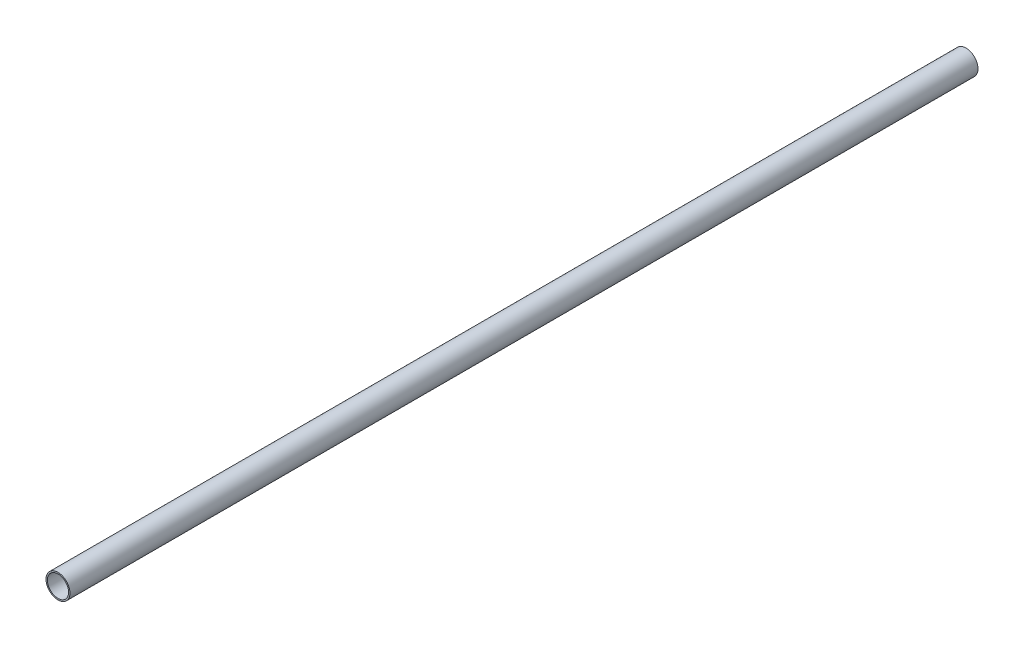
ISO-10303-21;
HEADER;
FILE_DESCRIPTION(('STEP AP214'),'2;1');
FILE_NAME('part.step','',(''),(''),'','','');
FILE_SCHEMA(('AUTOMOTIVE_DESIGN { 1 0 10303 214 1 1 1 1 }'));
ENDSEC;
DATA;
#1=APPLICATION_CONTEXT('core data for automotive mechanical design processes');
#2=APPLICATION_PROTOCOL_DEFINITION('international standard','automotive_design',2000,#1);
#3=PRODUCT_CONTEXT('',#1,'mechanical');
#4=PRODUCT('Part','Part','',(#3));
#5=PRODUCT_RELATED_PRODUCT_CATEGORY('part','',(#4));
#6=PRODUCT_DEFINITION_FORMATION('','',#4);
#7=PRODUCT_DEFINITION_CONTEXT('part definition',#1,'design');
#8=PRODUCT_DEFINITION('design','',#6,#7);
#9=PRODUCT_DEFINITION_SHAPE('','',#8);
#10=(LENGTH_UNIT() NAMED_UNIT(*) SI_UNIT(.MILLI.,.METRE.));
#11=(NAMED_UNIT(*) PLANE_ANGLE_UNIT() SI_UNIT($,.RADIAN.));
#12=(NAMED_UNIT(*) SI_UNIT($,.STERADIAN.) SOLID_ANGLE_UNIT());
#13=UNCERTAINTY_MEASURE_WITH_UNIT(LENGTH_MEASURE(1.E-05),#10,'distance_accuracy_value','');
#14=(GEOMETRIC_REPRESENTATION_CONTEXT(3) GLOBAL_UNCERTAINTY_ASSIGNED_CONTEXT((#13)) GLOBAL_UNIT_ASSIGNED_CONTEXT((#10,
#11,#12)) REPRESENTATION_CONTEXT('',''));
#15=CARTESIAN_POINT('',(0.,0.,0.));
#16=DIRECTION('',(0.,0.,1.));
#17=DIRECTION('',(1.,0.,0.));
#18=AXIS2_PLACEMENT_3D('',#15,#16,#17);
#19=CARTESIAN_POINT('',(0.,0.,914.4));
#20=DIRECTION('',(0.,0.,1.));
#21=DIRECTION('',(1.,0.,0.));
#22=AXIS2_PLACEMENT_3D('',#19,#20,#21);
#23=PLANE('',#22);
#24=CARTESIAN_POINT('',(0.,0.,914.4));
#25=DIRECTION('',(0.,0.,1.));
#26=DIRECTION('',(1.,0.,0.));
#27=AXIS2_PLACEMENT_3D('',#24,#25,#26);
#28=CIRCLE('',#27,24.13);
#29=CARTESIAN_POINT('',(-24.13,0.,914.4));
#30=VERTEX_POINT('',#29);
#31=EDGE_CURVE('E10',#30,#30,#28,.T.);
#32=ORIENTED_EDGE('',*,*,#31,.T.);
#33=EDGE_LOOP('',(#32));
#34=FACE_BOUND('',#33,.T.);
#35=CARTESIAN_POINT('',(0.,0.,914.4));
#36=DIRECTION('',(0.,0.,1.));
#37=DIRECTION('',(1.,0.,0.));
#38=AXIS2_PLACEMENT_3D('',#35,#36,#37);
#39=CIRCLE('',#38,21.3614);
#40=CARTESIAN_POINT('',(-21.3614,0.,914.4));
#41=VERTEX_POINT('',#40);
#42=EDGE_CURVE('E37',#41,#41,#39,.T.);
#43=ORIENTED_EDGE('',*,*,#42,.F.);
#44=EDGE_LOOP('',(#43));
#45=FACE_BOUND('',#44,.T.);
#46=ADVANCED_FACE('F30',(#34,#45),#23,.T.);
#47=CARTESIAN_POINT('',(0.,0.,914.4));
#48=DIRECTION('',(0.,0.,-1.));
#49=DIRECTION('',(-1.,0.,0.));
#50=AXIS2_PLACEMENT_3D('',#47,#48,#49);
#51=CYLINDRICAL_SURFACE('',#50,24.13);
#52=CARTESIAN_POINT('',(0.,0.,-914.4));
#53=DIRECTION('',(0.,0.,1.));
#54=DIRECTION('',(1.,0.,0.));
#55=AXIS2_PLACEMENT_3D('',#52,#53,#54);
#56=CIRCLE('',#55,24.13);
#57=CARTESIAN_POINT('',(-24.13,0.,-914.4));
#58=VERTEX_POINT('',#57);
#59=EDGE_CURVE('E41',#58,#58,#56,.T.);
#60=CARTESIAN_POINT('',(-24.13,0.,914.4));
#61=CARTESIAN_POINT('',(-24.13,0.,895.35));
#62=CARTESIAN_POINT('',(-24.13,0.,876.3));
#63=CARTESIAN_POINT('',(-24.13,0.,838.2));
#64=CARTESIAN_POINT('',(-24.13,0.,819.15));
#65=CARTESIAN_POINT('',(-24.13,0.,781.05));
#66=CARTESIAN_POINT('',(-24.13,0.,762.));
#67=CARTESIAN_POINT('',(-24.13,0.,723.9));
#68=CARTESIAN_POINT('',(-24.13,0.,704.85));
#69=CARTESIAN_POINT('',(-24.13,0.,666.75));
#70=CARTESIAN_POINT('',(-24.13,0.,647.7));
#71=CARTESIAN_POINT('',(-24.13,0.,609.6));
#72=CARTESIAN_POINT('',(-24.13,0.,590.55));
#73=CARTESIAN_POINT('',(-24.13,0.,552.45));
#74=CARTESIAN_POINT('',(-24.13,0.,533.4));
#75=CARTESIAN_POINT('',(-24.13,0.,495.3));
#76=CARTESIAN_POINT('',(-24.13,0.,476.25));
#77=CARTESIAN_POINT('',(-24.13,0.,438.15));
#78=CARTESIAN_POINT('',(-24.13,0.,419.1));
#79=CARTESIAN_POINT('',(-24.13,0.,381.));
#80=CARTESIAN_POINT('',(-24.13,0.,361.95));
#81=CARTESIAN_POINT('',(-24.13,0.,323.85));
#82=CARTESIAN_POINT('',(-24.13,0.,304.8));
#83=CARTESIAN_POINT('',(-24.13,0.,266.7));
#84=CARTESIAN_POINT('',(-24.13,0.,247.65));
#85=CARTESIAN_POINT('',(-24.13,0.,209.55));
#86=CARTESIAN_POINT('',(-24.13,0.,190.5));
#87=CARTESIAN_POINT('',(-24.13,0.,152.4));
#88=CARTESIAN_POINT('',(-24.13,0.,133.35));
#89=CARTESIAN_POINT('',(-24.13,0.,95.2499999999999));
#90=CARTESIAN_POINT('',(-24.13,0.,76.1999999999999));
#91=CARTESIAN_POINT('',(-24.13,0.,38.0999999999999));
#92=CARTESIAN_POINT('',(-24.13,0.,19.0499999999999));
#93=CARTESIAN_POINT('',(-24.13,0.,-19.0500000000001));
#94=CARTESIAN_POINT('',(-24.13,0.,-38.1000000000001));
#95=CARTESIAN_POINT('',(-24.13,0.,-76.2000000000001));
#96=CARTESIAN_POINT('',(-24.13,0.,-95.2500000000001));
#97=CARTESIAN_POINT('',(-24.13,0.,-133.35));
#98=CARTESIAN_POINT('',(-24.13,0.,-152.4));
#99=CARTESIAN_POINT('',(-24.13,0.,-190.5));
#100=CARTESIAN_POINT('',(-24.13,0.,-209.55));
#101=CARTESIAN_POINT('',(-24.13,0.,-247.65));
#102=CARTESIAN_POINT('',(-24.13,0.,-266.7));
#103=CARTESIAN_POINT('',(-24.13,0.,-304.8));
#104=CARTESIAN_POINT('',(-24.13,0.,-323.85));
#105=CARTESIAN_POINT('',(-24.13,0.,-361.95));
#106=CARTESIAN_POINT('',(-24.13,0.,-381.));
#107=CARTESIAN_POINT('',(-24.13,0.,-419.1));
#108=CARTESIAN_POINT('',(-24.13,0.,-438.15));
#109=CARTESIAN_POINT('',(-24.13,0.,-476.25));
#110=CARTESIAN_POINT('',(-24.13,0.,-495.3));
#111=CARTESIAN_POINT('',(-24.13,0.,-533.4));
#112=CARTESIAN_POINT('',(-24.13,0.,-552.45));
#113=CARTESIAN_POINT('',(-24.13,0.,-590.55));
#114=CARTESIAN_POINT('',(-24.13,0.,-609.6));
#115=CARTESIAN_POINT('',(-24.13,0.,-647.7));
#116=CARTESIAN_POINT('',(-24.13,0.,-666.75));
#117=CARTESIAN_POINT('',(-24.13,0.,-704.85));
#118=CARTESIAN_POINT('',(-24.13,0.,-723.9));
#119=CARTESIAN_POINT('',(-24.13,0.,-762.));
#120=CARTESIAN_POINT('',(-24.13,0.,-781.05));
#121=CARTESIAN_POINT('',(-24.13,0.,-819.15));
#122=CARTESIAN_POINT('',(-24.13,0.,-838.2));
#123=CARTESIAN_POINT('',(-24.13,0.,-876.3));
#124=CARTESIAN_POINT('',(-24.13,0.,-895.35));
#125=CARTESIAN_POINT('',(-24.13,0.,-914.4));
#126=B_SPLINE_CURVE_WITH_KNOTS('',3,(#60,#61,#62,#63,#64,#65,#66,#67,#68,#69,#70,#71,#72,#73,
#74,#75,#76,#77,#78,#79,#80,#81,#82,#83,#84,#85,#86,#87,#88,#89,#90,#91,#92,#93,#94,#95,#96,#97,
#98,#99,#100,#101,#102,#103,#104,#105,#106,#107,#108,#109,#110,#111,#112,#113,#114,#115,#116,
#117,#118,#119,#120,#121,#122,#123,#124,#125),.UNSPECIFIED.,.F.,.F.,(4,2,2,2,2,2,2,2,2,2,2,2,2,
2,2,2,2,2,2,2,2,2,2,2,2,2,2,2,2,2,2,2,4),(0.,57.15,114.3,171.45,228.6,285.75,342.9,400.05,457.2,
514.35,571.5,628.65,685.8,742.95,800.1,857.25,914.4,971.55,1028.7,1085.85,1143.,1200.15,1257.3,
1314.45,1371.6,1428.75,1485.9,1543.05,1600.2,1657.35,1714.5,1771.65,1828.8),.UNSPECIFIED.);
#127=EDGE_CURVE('BSEAM32',#30,#58,#126,.T.);
#128=ORIENTED_EDGE('',*,*,#31,.F.);
#129=ORIENTED_EDGE('',*,*,#59,.T.);
#130=ORIENTED_EDGE('',*,*,#127,.T.);
#131=ORIENTED_EDGE('',*,*,#127,.F.);
#132=EDGE_LOOP('',(#128,#130,#129,#131));
#133=FACE_BOUND('',#132,.T.);
#134=ADVANCED_FACE('F32',(#133),#51,.T.);
#135=CARTESIAN_POINT('',(0.,0.,914.4));
#136=DIRECTION('',(0.,0.,-1.));
#137=DIRECTION('',(-1.,0.,0.));
#138=AXIS2_PLACEMENT_3D('',#135,#136,#137);
#139=CYLINDRICAL_SURFACE('',#138,21.3614);
#140=CARTESIAN_POINT('',(0.,0.,-914.4));
#141=DIRECTION('',(0.,0.,1.));
#142=DIRECTION('',(1.,0.,0.));
#143=AXIS2_PLACEMENT_3D('',#140,#141,#142);
#144=CIRCLE('',#143,21.3614);
#145=CARTESIAN_POINT('',(-21.3614,0.,-914.4));
#146=VERTEX_POINT('',#145);
#147=EDGE_CURVE('E45',#146,#146,#144,.T.);
#148=CARTESIAN_POINT('',(-21.3614,0.,914.4));
#149=CARTESIAN_POINT('',(-21.3614,0.,895.35));
#150=CARTESIAN_POINT('',(-21.3614,0.,876.3));
#151=CARTESIAN_POINT('',(-21.3614,0.,838.2));
#152=CARTESIAN_POINT('',(-21.3614,0.,819.15));
#153=CARTESIAN_POINT('',(-21.3614,0.,781.05));
#154=CARTESIAN_POINT('',(-21.3614,0.,762.));
#155=CARTESIAN_POINT('',(-21.3614,0.,723.9));
#156=CARTESIAN_POINT('',(-21.3614,0.,704.85));
#157=CARTESIAN_POINT('',(-21.3614,0.,666.75));
#158=CARTESIAN_POINT('',(-21.3614,0.,647.7));
#159=CARTESIAN_POINT('',(-21.3614,0.,609.6));
#160=CARTESIAN_POINT('',(-21.3614,0.,590.55));
#161=CARTESIAN_POINT('',(-21.3614,0.,552.45));
#162=CARTESIAN_POINT('',(-21.3614,0.,533.4));
#163=CARTESIAN_POINT('',(-21.3614,0.,495.3));
#164=CARTESIAN_POINT('',(-21.3614,0.,476.25));
#165=CARTESIAN_POINT('',(-21.3614,0.,438.15));
#166=CARTESIAN_POINT('',(-21.3614,0.,419.1));
#167=CARTESIAN_POINT('',(-21.3614,0.,381.));
#168=CARTESIAN_POINT('',(-21.3614,0.,361.95));
#169=CARTESIAN_POINT('',(-21.3614,0.,323.85));
#170=CARTESIAN_POINT('',(-21.3614,0.,304.8));
#171=CARTESIAN_POINT('',(-21.3614,0.,266.7));
#172=CARTESIAN_POINT('',(-21.3614,0.,247.65));
#173=CARTESIAN_POINT('',(-21.3614,0.,209.55));
#174=CARTESIAN_POINT('',(-21.3614,0.,190.5));
#175=CARTESIAN_POINT('',(-21.3614,0.,152.4));
#176=CARTESIAN_POINT('',(-21.3614,0.,133.35));
#177=CARTESIAN_POINT('',(-21.3614,0.,95.2499999999998));
#178=CARTESIAN_POINT('',(-21.3614,0.,76.1999999999998));
#179=CARTESIAN_POINT('',(-21.3614,0.,38.0999999999998));
#180=CARTESIAN_POINT('',(-21.3614,0.,19.0499999999998));
#181=CARTESIAN_POINT('',(-21.3614,0.,-19.0500000000002));
#182=CARTESIAN_POINT('',(-21.3614,0.,-38.1000000000002));
#183=CARTESIAN_POINT('',(-21.3614,0.,-76.2000000000002));
#184=CARTESIAN_POINT('',(-21.3614,0.,-95.2500000000001));
#185=CARTESIAN_POINT('',(-21.3614,0.,-133.35));
#186=CARTESIAN_POINT('',(-21.3614,0.,-152.4));
#187=CARTESIAN_POINT('',(-21.3614,0.,-190.5));
#188=CARTESIAN_POINT('',(-21.3614,0.,-209.55));
#189=CARTESIAN_POINT('',(-21.3614,0.,-247.65));
#190=CARTESIAN_POINT('',(-21.3614,0.,-266.7));
#191=CARTESIAN_POINT('',(-21.3614,0.,-304.8));
#192=CARTESIAN_POINT('',(-21.3614,0.,-323.85));
#193=CARTESIAN_POINT('',(-21.3614,0.,-361.95));
#194=CARTESIAN_POINT('',(-21.3614,0.,-381.));
#195=CARTESIAN_POINT('',(-21.3614,0.,-419.1));
#196=CARTESIAN_POINT('',(-21.3614,0.,-438.15));
#197=CARTESIAN_POINT('',(-21.3614,0.,-476.25));
#198=CARTESIAN_POINT('',(-21.3614,0.,-495.3));
#199=CARTESIAN_POINT('',(-21.3614,0.,-533.4));
#200=CARTESIAN_POINT('',(-21.3614,0.,-552.45));
#201=CARTESIAN_POINT('',(-21.3614,0.,-590.55));
#202=CARTESIAN_POINT('',(-21.3614,0.,-609.6));
#203=CARTESIAN_POINT('',(-21.3614,0.,-647.7));
#204=CARTESIAN_POINT('',(-21.3614,0.,-666.75));
#205=CARTESIAN_POINT('',(-21.3614,0.,-704.85));
#206=CARTESIAN_POINT('',(-21.3614,0.,-723.9));
#207=CARTESIAN_POINT('',(-21.3614,0.,-762.));
#208=CARTESIAN_POINT('',(-21.3614,0.,-781.05));
#209=CARTESIAN_POINT('',(-21.3614,0.,-819.15));
#210=CARTESIAN_POINT('',(-21.3614,0.,-838.2));
#211=CARTESIAN_POINT('',(-21.3614,0.,-876.3));
#212=CARTESIAN_POINT('',(-21.3614,0.,-895.35));
#213=CARTESIAN_POINT('',(-21.3614,0.,-914.4));
#214=B_SPLINE_CURVE_WITH_KNOTS('',3,(#148,#149,#150,#151,#152,#153,#154,#155,#156,#157,#158,
#159,#160,#161,#162,#163,#164,#165,#166,#167,#168,#169,#170,#171,#172,#173,#174,#175,#176,#177,
#178,#179,#180,#181,#182,#183,#184,#185,#186,#187,#188,#189,#190,#191,#192,#193,#194,#195,#196,
#197,#198,#199,#200,#201,#202,#203,#204,#205,#206,#207,#208,#209,#210,#211,#212,#213),
.UNSPECIFIED.,.F.,.F.,(4,2,2,2,2,2,2,2,2,2,2,2,2,2,2,2,2,2,2,2,2,2,2,2,2,2,2,2,2,2,2,2,4),(0.,
57.1499999999999,114.3,171.45,228.6,285.75,342.9,400.05,457.2,514.35,571.5,628.65,685.8,742.95,
800.1,857.25,914.4,971.55,1028.7,1085.85,1143.,1200.15,1257.3,1314.45,1371.6,1428.75,1485.9,
1543.05,1600.2,1657.35,1714.5,1771.65,1828.8),.UNSPECIFIED.);
#215=EDGE_CURVE('BSEAM54',#41,#146,#214,.T.);
#216=ORIENTED_EDGE('',*,*,#42,.T.);
#217=ORIENTED_EDGE('',*,*,#147,.F.);
#218=ORIENTED_EDGE('',*,*,#215,.T.);
#219=ORIENTED_EDGE('',*,*,#215,.F.);
#220=EDGE_LOOP('',(#216,#218,#217,#219));
#221=FACE_BOUND('',#220,.T.);
#222=ADVANCED_FACE('F54',(#221),#139,.F.);
#223=CARTESIAN_POINT('',(0.,0.,-914.4));
#224=DIRECTION('',(0.,0.,1.));
#225=DIRECTION('',(1.,0.,0.));
#226=AXIS2_PLACEMENT_3D('',#223,#224,#225);
#227=PLANE('',#226);
#228=ORIENTED_EDGE('',*,*,#147,.T.);
#229=EDGE_LOOP('',(#228));
#230=FACE_BOUND('',#229,.T.);
#231=ORIENTED_EDGE('',*,*,#59,.F.);
#232=EDGE_LOOP('',(#231));
#233=FACE_BOUND('',#232,.T.);
#234=ADVANCED_FACE('F51',(#230,#233),#227,.F.);
#235=CLOSED_SHELL('',(#46,#134,#222,#234));
#236=MANIFOLD_SOLID_BREP('B2',#235);
#237=ADVANCED_BREP_SHAPE_REPRESENTATION('',(#18,#236),#14);
#238=SHAPE_DEFINITION_REPRESENTATION(#9,#237);
ENDSEC;
END-ISO-10303-21;
